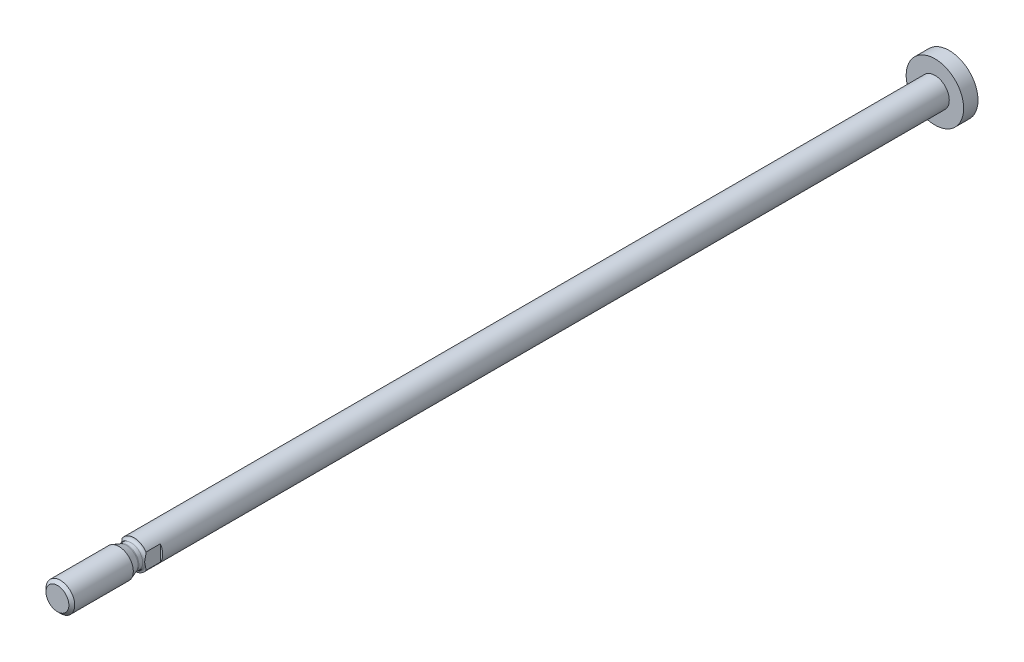
ISO-10303-21;
HEADER;
FILE_DESCRIPTION(('STEP AP214'),'2;1');
FILE_NAME('part.step','',(''),(''),'','','');
FILE_SCHEMA(('AUTOMOTIVE_DESIGN { 1 0 10303 214 1 1 1 1 }'));
ENDSEC;
DATA;
#1=APPLICATION_CONTEXT('core data for automotive mechanical design processes');
#2=APPLICATION_PROTOCOL_DEFINITION('international standard','automotive_design',2000,#1);
#3=PRODUCT_CONTEXT('',#1,'mechanical');
#4=PRODUCT('Part','Part','',(#3));
#5=PRODUCT_RELATED_PRODUCT_CATEGORY('part','',(#4));
#6=PRODUCT_DEFINITION_FORMATION('','',#4);
#7=PRODUCT_DEFINITION_CONTEXT('part definition',#1,'design');
#8=PRODUCT_DEFINITION('design','',#6,#7);
#9=PRODUCT_DEFINITION_SHAPE('','',#8);
#10=(LENGTH_UNIT() NAMED_UNIT(*) SI_UNIT(.MILLI.,.METRE.));
#11=(NAMED_UNIT(*) PLANE_ANGLE_UNIT() SI_UNIT($,.RADIAN.));
#12=(NAMED_UNIT(*) SI_UNIT($,.STERADIAN.) SOLID_ANGLE_UNIT());
#13=UNCERTAINTY_MEASURE_WITH_UNIT(LENGTH_MEASURE(1.E-05),#10,'distance_accuracy_value','');
#14=(GEOMETRIC_REPRESENTATION_CONTEXT(3) GLOBAL_UNCERTAINTY_ASSIGNED_CONTEXT((#13)) GLOBAL_UNIT_ASSIGNED_CONTEXT((#10,
#11,#12)) REPRESENTATION_CONTEXT('',''));
#15=CARTESIAN_POINT('',(0.,0.,0.));
#16=DIRECTION('',(0.,0.,1.));
#17=DIRECTION('',(1.,0.,0.));
#18=AXIS2_PLACEMENT_3D('',#15,#16,#17);
#19=CARTESIAN_POINT('',(0.,0.,-165.3));
#20=DIRECTION('',(0.,0.,1.));
#21=DIRECTION('',(1.,0.,0.));
#22=AXIS2_PLACEMENT_3D('',#19,#20,#21);
#23=CYLINDRICAL_SURFACE('',#22,3.);
#24=CARTESIAN_POINT('',(0.,0.,-162.3));
#25=DIRECTION('',(0.,0.,1.));
#26=DIRECTION('',(1.,0.,0.));
#27=AXIS2_PLACEMENT_3D('',#24,#25,#26);
#28=CIRCLE('',#27,3.);
#29=CARTESIAN_POINT('',(3.,0.,-162.3));
#30=VERTEX_POINT('',#29);
#31=EDGE_CURVE('E121',#30,#30,#28,.T.);
#32=ORIENTED_EDGE('',*,*,#31,.T.);
#33=EDGE_LOOP('',(#32));
#34=FACE_BOUND('',#33,.T.);
#35=DIRECTION('',(0.,0.,1.));
#36=VECTOR('',#35,1.);
#37=CARTESIAN_POINT('',(-2.5,-1.6583123951777,-165.3));
#38=LINE('',#37,#36);
#39=CARTESIAN_POINT('',(-2.5,-1.6583123951777,2.));
#40=VERTEX_POINT('',#39);
#41=CARTESIAN_POINT('',(-2.5,-1.6583123951777,5.));
#42=VERTEX_POINT('',#41);
#43=EDGE_CURVE('E51',#40,#42,#38,.T.);
#44=ORIENTED_EDGE('',*,*,#43,.F.);
#45=CARTESIAN_POINT('',(0.,0.,2.));
#46=DIRECTION('',(0.,0.,1.));
#47=DIRECTION('',(1.,0.,0.));
#48=AXIS2_PLACEMENT_3D('',#45,#46,#47);
#49=CIRCLE('',#48,3.);
#50=CARTESIAN_POINT('',(-2.5,1.6583123951777,2.));
#51=VERTEX_POINT('',#50);
#52=EDGE_CURVE('E11',#51,#40,#49,.T.);
#53=ORIENTED_EDGE('',*,*,#52,.F.);
#54=DIRECTION('',(0.,0.,1.));
#55=VECTOR('',#54,1.);
#56=CARTESIAN_POINT('',(-2.5,1.6583123951777,-165.3));
#57=LINE('',#56,#55);
#58=CARTESIAN_POINT('',(-2.5,1.65831239517778,4.99999999999909));
#59=VERTEX_POINT('',#58);
#60=EDGE_CURVE('E91',#59,#51,#57,.F.);
#61=ORIENTED_EDGE('',*,*,#60,.F.);
#62=CARTESIAN_POINT('',(0.,0.,5.));
#63=DIRECTION('',(0.,0.,1.));
#64=DIRECTION('',(1.,0.,0.));
#65=AXIS2_PLACEMENT_3D('',#62,#63,#64);
#66=CIRCLE('',#65,3.);
#67=CARTESIAN_POINT('',(2.5,1.6583123951777,5.));
#68=VERTEX_POINT('',#67);
#69=EDGE_CURVE('E90',#68,#59,#66,.T.);
#70=ORIENTED_EDGE('',*,*,#69,.F.);
#71=DIRECTION('',(0.,0.,1.));
#72=VECTOR('',#71,1.);
#73=CARTESIAN_POINT('',(2.5,1.6583123951777,-165.3));
#74=LINE('',#73,#72);
#75=CARTESIAN_POINT('',(2.5,1.6583123951777,2.));
#76=VERTEX_POINT('',#75);
#77=EDGE_CURVE('E59',#76,#68,#74,.T.);
#78=ORIENTED_EDGE('',*,*,#77,.F.);
#79=CARTESIAN_POINT('',(2.5,-1.6583123951777,2.));
#80=VERTEX_POINT('',#79);
#81=EDGE_CURVE('E40',#80,#76,#49,.T.);
#82=ORIENTED_EDGE('',*,*,#81,.F.);
#83=DIRECTION('',(0.,0.,1.));
#84=VECTOR('',#83,1.);
#85=CARTESIAN_POINT('',(2.5,-1.6583123951777,-165.3));
#86=LINE('',#85,#84);
#87=CARTESIAN_POINT('',(2.5,-1.65831239517778,4.99999999999909));
#88=VERTEX_POINT('',#87);
#89=EDGE_CURVE('E84',#88,#80,#86,.F.);
#90=ORIENTED_EDGE('',*,*,#89,.F.);
#91=EDGE_CURVE('E124',#42,#88,#66,.T.);
#92=ORIENTED_EDGE('',*,*,#91,.F.);
#93=EDGE_LOOP('',(#44,#53,#61,#70,#78,#82,#90,#92));
#94=FACE_BOUND('',#93,.T.);
#95=ADVANCED_FACE('F37',(#34,#94),#23,.T.);
#96=CARTESIAN_POINT('',(0.,0.,5.6000000000001));
#97=DIRECTION('',(0.,0.,1.));
#98=DIRECTION('',(1.,0.,0.));
#99=AXIS2_PLACEMENT_3D('',#96,#97,#98);
#100=TOROIDAL_SURFACE('',#99,3.0000000000001,0.600000000000099);
#101=CARTESIAN_POINT('',(0.,0.,5.6));
#102=DIRECTION('',(0.,0.,1.));
#103=DIRECTION('',(1.,0.,0.));
#104=AXIS2_PLACEMENT_3D('',#101,#102,#103);
#105=CIRCLE('',#104,2.4);
#106=CARTESIAN_POINT('',(2.4,0.,5.6));
#107=VERTEX_POINT('',#106);
#108=EDGE_CURVE('E112',#107,#107,#105,.T.);
#109=ORIENTED_EDGE('',*,*,#108,.F.);
#110=EDGE_LOOP('',(#109));
#111=FACE_BOUND('',#110,.T.);
#112=CARTESIAN_POINT('',(-2.5,0.,5.26833752096453));
#113=CARTESIAN_POINT('',(-2.5,0.0507234426297441,5.26834839993848));
#114=CARTESIAN_POINT('',(-2.5,0.101441776799662,5.26596843791489));
#115=CARTESIAN_POINT('',(-2.5,0.202536067556288,5.2569952015163));
#116=CARTESIAN_POINT('',(-2.5,0.252911588949165,5.2503973212644));
#117=CARTESIAN_POINT('',(-2.5,0.35392632203634,5.23403658213965));
#118=CARTESIAN_POINT('',(-2.5,0.404557369480025,5.224225913585));
#119=CARTESIAN_POINT('',(-2.5,0.505400398866161,5.20278595137819));
#120=CARTESIAN_POINT('',(-2.5,0.555612509775304,5.1911572409283));
#121=CARTESIAN_POINT('',(-2.5,0.655655613826413,5.16721678219831));
#122=CARTESIAN_POINT('',(-2.5,0.705487327239528,5.15490798008948));
#123=CARTESIAN_POINT('',(-2.5,0.805181864056362,5.13041893752706));
#124=CARTESIAN_POINT('',(-2.5,0.855044688832192,5.11823870324147));
#125=CARTESIAN_POINT('',(-2.5,1.00507376125951,5.08293674920261));
#126=CARTESIAN_POINT('',(-2.5,1.1055660279648,5.06108488117838));
#127=CARTESIAN_POINT('',(-2.5,1.30645493621981,5.02592717471424));
#128=CARTESIAN_POINT('',(-2.5,1.40682678389803,5.01248870030289));
#129=CARTESIAN_POINT('',(-2.5,1.60840199518987,4.99838763017595));
#130=CARTESIAN_POINT('',(-2.5,1.70960094347028,4.99767823287719));
#131=CARTESIAN_POINT('',(-2.5,1.86622781794818,5.01106448653587));
#132=CARTESIAN_POINT('',(-2.5,1.92218137883188,5.01877622049858));
#133=CARTESIAN_POINT('',(-2.5,2.03285053262341,5.0413651074687));
#134=CARTESIAN_POINT('',(-2.5,2.08756307823151,5.05625824117348));
#135=CARTESIAN_POINT('',(-2.5,2.18328084843635,5.09083457513036));
#136=CARTESIAN_POINT('',(-2.5,2.22483950461237,5.10896465354793));
#137=CARTESIAN_POINT('',(-2.5,2.30459524648064,5.1515245306446));
#138=CARTESIAN_POINT('',(-2.5,2.34279989724468,5.17593963670877));
#139=CARTESIAN_POINT('',(-2.5,2.40362753966407,5.22361594487622));
#140=CARTESIAN_POINT('',(-2.5,2.42757076392253,5.24518752529637));
#141=CARTESIAN_POINT('',(-2.5,2.47175757689057,5.29185573262645));
#142=CARTESIAN_POINT('',(-2.5,2.49200531158724,5.31694835263777));
#143=CARTESIAN_POINT('',(-2.5,2.52468492158815,5.36594738678137));
#144=CARTESIAN_POINT('',(-2.5,2.53785643218482,5.38935828111803));
#145=CARTESIAN_POINT('',(-2.5,2.56013164913301,5.43805384411947));
#146=CARTESIAN_POINT('',(-2.5,2.56923737677398,5.46333757440499));
#147=CARTESIAN_POINT('',(-2.5,2.58283057049981,5.51527496834575));
#148=CARTESIAN_POINT('',(-2.5,2.58729356105886,5.54193512227162));
#149=CARTESIAN_POINT('',(-2.5,2.59118020467599,5.59561989324821));
#150=CARTESIAN_POINT('',(-2.5,2.5906054179438,5.62264439487102));
#151=CARTESIAN_POINT('',(-2.5,2.5847447911938,5.67371298536964));
#152=CARTESIAN_POINT('',(-2.5,2.57988467167735,5.69780754958458));
#153=CARTESIAN_POINT('',(-2.5,2.56633022368149,5.74488485425705));
#154=CARTESIAN_POINT('',(-2.5,2.55763543991684,5.76786746233366));
#155=CARTESIAN_POINT('',(-2.5,2.53647695281551,5.81308697753744));
#156=CARTESIAN_POINT('',(-2.5,2.52388217742275,5.83526203314746));
#157=CARTESIAN_POINT('',(-2.5,2.49565831542702,5.87756858678122));
#158=CARTESIAN_POINT('',(-2.5,2.4800283022487,5.897699457906));
#159=CARTESIAN_POINT('',(-2.5,2.4381803160609,5.94494905141413));
#160=CARTESIAN_POINT('',(-2.5,2.41048793322772,5.97076525046522));
#161=CARTESIAN_POINT('',(-2.5,2.35128940318857,6.01762864695372));
#162=CARTESIAN_POINT('',(-2.5,2.31977194494069,6.03866114436212));
#163=CARTESIAN_POINT('',(-2.5,2.23952256294481,6.08463351159361));
#164=CARTESIAN_POINT('',(-2.5,2.18939204577726,6.10711912432076));
#165=CARTESIAN_POINT('',(-2.5,2.086424206848,6.14398267826286));
#166=CARTESIAN_POINT('',(-2.5,2.03358928965091,6.15836768991921));
#167=CARTESIAN_POINT('',(-2.5,1.93599580204544,6.17849484994285));
#168=CARTESIAN_POINT('',(-2.5,1.89144834077192,6.18531116329585));
#169=CARTESIAN_POINT('',(-2.5,1.80189908033616,6.19505697557448));
#170=CARTESIAN_POINT('',(-2.5,1.75689686177072,6.19798247787778));
#171=CARTESIAN_POINT('',(-2.5,1.66646832286127,6.20053377831371));
#172=CARTESIAN_POINT('',(-2.5,1.6210413945456,6.20013412759755));
#173=CARTESIAN_POINT('',(-2.5,1.53034280767568,6.19650595241103));
#174=CARTESIAN_POINT('',(-2.5,1.48507106445849,6.1932793543307));
#175=CARTESIAN_POINT('',(-2.5,1.33918047559004,6.17906735223514));
#176=CARTESIAN_POINT('',(-2.5,1.23902345631669,6.16342028964884));
#177=CARTESIAN_POINT('',(-2.5,1.03994836030368,6.12508984420092));
#178=CARTESIAN_POINT('',(-2.5,0.941034235224376,6.10238806221333));
#179=CARTESIAN_POINT('',(-2.5,0.793509038998567,6.06677672186832));
#180=CARTESIAN_POINT('',(-2.5,0.7446863854637,6.054702575567));
#181=CARTESIAN_POINT('',(-2.5,0.646996290398524,6.030738686552));
#182=CARTESIAN_POINT('',(-2.5,0.598128851070118,6.0188489352388));
#183=CARTESIAN_POINT('',(-2.5,0.500334281886721,5.99617397742217));
#184=CARTESIAN_POINT('',(-2.5,0.451408146263369,5.98538460255591));
#185=CARTESIAN_POINT('',(-2.5,0.353119090508098,5.96594052833405));
#186=CARTESIAN_POINT('',(-2.5,0.303756196305667,5.95728570312374));
#187=CARTESIAN_POINT('',(-2.5,0.204122497966492,5.94328110899502));
#188=CARTESIAN_POINT('',(-2.5,0.153847567097064,5.93795905985694));
#189=CARTESIAN_POINT('',(-2.5,0.0530351286873156,5.93177082830429));
#190=CARTESIAN_POINT('',(-2.5,0.0024977994589948,5.930901937583));
#191=CARTESIAN_POINT('',(-2.5,-0.0985305210715612,5.93381110626722));
#192=CARTESIAN_POINT('',(-2.5,-0.14902123482016,5.93759813511376));
#193=CARTESIAN_POINT('',(-2.5,-0.249573888409545,5.94904126176878));
#194=CARTESIAN_POINT('',(-2.5,-0.299635458091892,5.95670041313862));
#195=CARTESIAN_POINT('',(-2.5,-0.399725252919972,5.97472154484855));
#196=CARTESIAN_POINT('',(-2.5,-0.449748880216866,5.98510788708088));
#197=CARTESIAN_POINT('',(-2.5,-0.549453617514231,6.00732659888942));
#198=CARTESIAN_POINT('',(-2.5,-0.599134785603654,6.01915871651809));
#199=CARTESIAN_POINT('',(-2.5,-0.698392421521691,6.04328051823731));
#200=CARTESIAN_POINT('',(-2.5,-0.747968869022546,6.05557028383309));
#201=CARTESIAN_POINT('',(-2.5,-0.84720464589227,6.07981009984425));
#202=CARTESIAN_POINT('',(-2.5,-0.896863971124109,6.0917601667094));
#203=CARTESIAN_POINT('',(-2.5,-0.975241469303783,6.10978478042876));
#204=CARTESIAN_POINT('',(-2.5,-1.00388150216564,6.11619624816889));
#205=CARTESIAN_POINT('',(-2.5,-1.06125902675178,6.12857195456169));
#206=CARTESIAN_POINT('',(-2.5,-1.08999652018277,6.13453618533974));
#207=CARTESIAN_POINT('',(-2.5,-1.14748265723325,6.1458846074232));
#208=CARTESIAN_POINT('',(-2.5,-1.17623091126653,6.15127075206469));
#209=CARTESIAN_POINT('',(-2.5,-1.23384312688132,6.16137594760793));
#210=CARTESIAN_POINT('',(-2.5,-1.26270708577413,6.16609501391968));
#211=CARTESIAN_POINT('',(-2.5,-1.34949136584038,6.17908804539659));
#212=CARTESIAN_POINT('',(-2.5,-1.40759592627029,6.18619616796949));
#213=CARTESIAN_POINT('',(-2.5,-1.52420669712544,6.19636423685649));
#214=CARTESIAN_POINT('',(-2.5,-1.58271310503325,6.1994220245478));
#215=CARTESIAN_POINT('',(-2.5,-1.70911532678372,6.20051114496721));
#216=CARTESIAN_POINT('',(-2.5,-1.77702602049488,6.19766666103081));
#217=CARTESIAN_POINT('',(-2.5,-1.912149147007,6.18315262249392));
#218=CARTESIAN_POINT('',(-2.5,-1.97936016975703,6.17146782027944));
#219=CARTESIAN_POINT('',(-2.5,-2.09293467910467,6.14162835403314));
#220=CARTESIAN_POINT('',(-2.5,-2.1399801193776,6.12611102431254));
#221=CARTESIAN_POINT('',(-2.5,-2.23116163556241,6.08815370009842));
#222=CARTESIAN_POINT('',(-2.5,-2.27530548479003,6.06573319994486));
#223=CARTESIAN_POINT('',(-2.5,-2.34660579555824,6.0206656653127));
#224=CARTESIAN_POINT('',(-2.5,-2.37498330055351,5.99995880382842));
#225=CARTESIAN_POINT('',(-2.5,-2.42818185419372,5.95435228802646));
#226=CARTESIAN_POINT('',(-2.5,-2.45300628498281,5.92945667074117));
#227=CARTESIAN_POINT('',(-2.5,-2.49337206402375,5.88080957286876));
#228=CARTESIAN_POINT('',(-2.5,-2.50977972671913,5.85778028891266));
#229=CARTESIAN_POINT('',(-2.5,-2.5385948801776,5.80932543735906));
#230=CARTESIAN_POINT('',(-2.5,-2.55100468980703,5.7839012699618));
#231=CARTESIAN_POINT('',(-2.5,-2.57111606880391,5.7310152189761));
#232=CARTESIAN_POINT('',(-2.5,-2.57878240755407,5.70353974708557));
#233=CARTESIAN_POINT('',(-2.5,-2.58865812747843,5.64762323062993));
#234=CARTESIAN_POINT('',(-2.5,-2.59087093912576,5.61918280447873));
#235=CARTESIAN_POINT('',(-2.5,-2.58974032110845,5.56589468768046));
#236=CARTESIAN_POINT('',(-2.5,-2.58704036062141,5.54103102121321));
#237=CARTESIAN_POINT('',(-2.5,-2.57748265423562,5.49212434637714));
#238=CARTESIAN_POINT('',(-2.5,-2.57062518368025,5.46808128377277));
#239=CARTESIAN_POINT('',(-2.5,-2.55318309970271,5.42147694109437));
#240=CARTESIAN_POINT('',(-2.5,-2.54260847384664,5.39891188066154));
#241=CARTESIAN_POINT('',(-2.5,-2.51826231502416,5.35558968714916));
#242=CARTESIAN_POINT('',(-2.5,-2.50448933519591,5.33483337816906));
#243=CARTESIAN_POINT('',(-2.5,-2.46797257111134,5.28708275256527));
#244=CARTESIAN_POINT('',(-2.5,-2.44388663659998,5.26111270404154));
#245=CARTESIAN_POINT('',(-2.5,-2.39183121173732,5.21341702762138));
#246=CARTESIAN_POINT('',(-2.5,-2.36385414462067,5.19169988455002));
#247=CARTESIAN_POINT('',(-2.5,-2.29309604385226,5.14424955817408));
#248=CARTESIAN_POINT('',(-2.5,-2.24896151787955,5.12054273771195));
#249=CARTESIAN_POINT('',(-2.5,-2.15755724893995,5.08032986787273));
#250=CARTESIAN_POINT('',(-2.5,-2.1102815253453,5.0638380357592));
#251=CARTESIAN_POINT('',(-2.5,-1.98539576167196,5.02901994971649));
#252=CARTESIAN_POINT('',(-2.5,-1.90647682078743,5.01544295171964));
#253=CARTESIAN_POINT('',(-2.5,-1.74768813149434,5.00017484346382));
#254=CARTESIAN_POINT('',(-2.5,-1.66781762927049,4.99849388464395));
#255=CARTESIAN_POINT('',(-2.5,-1.45429321635247,5.00579419289827));
#256=CARTESIAN_POINT('',(-2.5,-1.32097329964418,5.02279704607492));
#257=CARTESIAN_POINT('',(-2.5,-1.12273292987174,5.05843900515103));
#258=CARTESIAN_POINT('',(-2.5,-1.05669317759064,5.07208123732001));
#259=CARTESIAN_POINT('',(-2.5,-0.925080173294097,5.10144856377507));
#260=CARTESIAN_POINT('',(-2.5,-0.85950678696237,5.11717303045709));
#261=CARTESIAN_POINT('',(-2.5,-0.728157455724953,5.14928145287764));
#262=CARTESIAN_POINT('',(-2.5,-0.662382356378558,5.16566853749943));
#263=CARTESIAN_POINT('',(-2.5,-0.530451230737349,5.19710748690057));
#264=CARTESIAN_POINT('',(-2.5,-0.46429498692756,5.21215848739435));
#265=CARTESIAN_POINT('',(-2.5,-0.332137198799993,5.23811298682939));
#266=CARTESIAN_POINT('',(-2.5,-0.266147995614798,5.24907485812429));
#267=CARTESIAN_POINT('',(-2.5,-0.13343508853748,5.26417313941374));
#268=CARTESIAN_POINT('',(-2.5,-0.0667131258677896,5.26832321258322));
#269=CARTESIAN_POINT('',(-2.5,0.,5.26833752096453));
#270=B_SPLINE_CURVE_WITH_KNOTS('',3,(#112,#113,#114,#115,#116,#117,#118,#119,#120,#121,#122,
#123,#124,#125,#126,#127,#128,#129,#130,#131,#132,#133,#134,#135,#136,#137,#138,#139,#140,#141,
#142,#143,#144,#145,#146,#147,#148,#149,#150,#151,#152,#153,#154,#155,#156,#157,#158,#159,#160,
#161,#162,#163,#164,#165,#166,#167,#168,#169,#170,#171,#172,#173,#174,#175,#176,#177,#178,#179,
#180,#181,#182,#183,#184,#185,#186,#187,#188,#189,#190,#191,#192,#193,#194,#195,#196,#197,#198,
#199,#200,#201,#202,#203,#204,#205,#206,#207,#208,#209,#210,#211,#212,#213,#214,#215,#216,#217,
#218,#219,#220,#221,#222,#223,#224,#225,#226,#227,#228,#229,#230,#231,#232,#233,#234,#235,#236,
#237,#238,#239,#240,#241,#242,#243,#244,#245,#246,#247,#248,#249,#250,#251,#252,#253,#254,#255,
#256,#257,#258,#259,#260,#261,#262,#263,#264,#265,#266,#267,#268,#269),.UNSPECIFIED.,.T.,.F.,(4,
2,2,2,2,2,2,2,2,2,2,2,2,2,2,2,2,2,2,2,2,2,2,2,2,2,2,2,2,2,2,2,2,2,2,2,2,2,2,2,2,2,2,2,2,2,2,2,2,
2,2,2,2,2,2,2,2,2,2,2,2,2,2,2,2,2,2,2,2,2,2,2,2,2,2,2,2,2,4),(0.,0.152115749462961,
0.304397890479205,0.459057777660119,0.613668153537359,0.76765452052503,0.921648241698668,
1.22999186740174,1.53334327295527,1.83557910296654,2.00468122496769,2.17416139710525,
2.30975526259906,2.44503498191611,2.54138706790922,2.63763038250484,2.71788414225495,
2.79809795959123,2.87873253660465,2.95934214181033,3.03274594433316,3.10615846435156,
3.18237030946167,3.25860545664829,3.37154774885102,3.48483255287211,3.64874326809032,
3.81251069461259,3.94751849926572,4.08266487644991,4.21884653384819,4.35493546397263,
4.65852821936571,4.96291950372185,5.11380283698696,5.2646791123006,5.41496078164642,
5.56523358814694,5.71674021710462,5.86815469233289,6.01986131905259,6.17168776888823,
6.3249195654772,6.47812469716163,6.63135724578266,6.7845823615018,6.87262624262423,
6.9606716735928,7.04840955727845,7.13614541382411,7.31164210225534,7.487232283928,
7.69072100095721,7.89456149389004,8.04275027379228,8.1905243529531,8.29556794817655,
8.40051087855684,8.48500651711341,8.56945305722983,8.65451949621374,8.73953241154295,
8.81419843639983,8.88885951681877,8.96332150589878,9.03781724571823,9.14348655987521,
9.24936459025057,9.39882327642183,9.54857516145059,9.78744806917548,10.0265247936209,
10.4280628477144,10.630387719692,10.8326517473681,11.0360188284461,11.239516519211,
11.439986712254,11.6400543065313),.UNSPECIFIED.);
#271=EDGE_CURVE('E82',#42,#59,#270,.T.);
#272=ORIENTED_EDGE('',*,*,#271,.F.);
#273=ORIENTED_EDGE('',*,*,#91,.T.);
#274=CARTESIAN_POINT('',(2.5,0.,5.26833752096453));
#275=CARTESIAN_POINT('',(2.5,-0.0507234426297441,5.26834839993848));
#276=CARTESIAN_POINT('',(2.5,-0.101441776799662,5.26596843791489));
#277=CARTESIAN_POINT('',(2.5,-0.202536067556288,5.2569952015163));
#278=CARTESIAN_POINT('',(2.5,-0.252911588949165,5.2503973212644));
#279=CARTESIAN_POINT('',(2.5,-0.35392632203634,5.23403658213965));
#280=CARTESIAN_POINT('',(2.5,-0.404557369480025,5.224225913585));
#281=CARTESIAN_POINT('',(2.5,-0.505400398866161,5.20278595137819));
#282=CARTESIAN_POINT('',(2.5,-0.555612509775304,5.1911572409283));
#283=CARTESIAN_POINT('',(2.5,-0.655655613826413,5.16721678219831));
#284=CARTESIAN_POINT('',(2.5,-0.705487327239528,5.15490798008948));
#285=CARTESIAN_POINT('',(2.5,-0.805181864056362,5.13041893752706));
#286=CARTESIAN_POINT('',(2.5,-0.855044688832192,5.11823870324147));
#287=CARTESIAN_POINT('',(2.5,-1.00507376125951,5.08293674920261));
#288=CARTESIAN_POINT('',(2.5,-1.1055660279648,5.06108488117838));
#289=CARTESIAN_POINT('',(2.5,-1.30645493621981,5.02592717471424));
#290=CARTESIAN_POINT('',(2.5,-1.40682678389803,5.01248870030289));
#291=CARTESIAN_POINT('',(2.5,-1.60840199518987,4.99838763017595));
#292=CARTESIAN_POINT('',(2.5,-1.70960094347028,4.99767823287719));
#293=CARTESIAN_POINT('',(2.5,-1.86622781794818,5.01106448653587));
#294=CARTESIAN_POINT('',(2.5,-1.92218137883188,5.01877622049858));
#295=CARTESIAN_POINT('',(2.5,-2.03285053262341,5.0413651074687));
#296=CARTESIAN_POINT('',(2.5,-2.08756307823151,5.05625824117348));
#297=CARTESIAN_POINT('',(2.5,-2.18328084843635,5.09083457513036));
#298=CARTESIAN_POINT('',(2.5,-2.22483950461237,5.10896465354793));
#299=CARTESIAN_POINT('',(2.5,-2.30459524648064,5.1515245306446));
#300=CARTESIAN_POINT('',(2.5,-2.34279989724468,5.17593963670877));
#301=CARTESIAN_POINT('',(2.5,-2.40362753966407,5.22361594487622));
#302=CARTESIAN_POINT('',(2.5,-2.42757076392253,5.24518752529637));
#303=CARTESIAN_POINT('',(2.5,-2.47175757689057,5.29185573262645));
#304=CARTESIAN_POINT('',(2.5,-2.49200531158724,5.31694835263777));
#305=CARTESIAN_POINT('',(2.5,-2.52468492158815,5.36594738678137));
#306=CARTESIAN_POINT('',(2.5,-2.53785643218482,5.38935828111803));
#307=CARTESIAN_POINT('',(2.5,-2.56013164913301,5.43805384411947));
#308=CARTESIAN_POINT('',(2.5,-2.56923737677398,5.46333757440499));
#309=CARTESIAN_POINT('',(2.5,-2.58283057049981,5.51527496834575));
#310=CARTESIAN_POINT('',(2.5,-2.58729356105886,5.54193512227162));
#311=CARTESIAN_POINT('',(2.5,-2.59118020467599,5.59561989324821));
#312=CARTESIAN_POINT('',(2.5,-2.5906054179438,5.62264439487102));
#313=CARTESIAN_POINT('',(2.5,-2.5847447911938,5.67371298536964));
#314=CARTESIAN_POINT('',(2.5,-2.57988467167735,5.69780754958458));
#315=CARTESIAN_POINT('',(2.5,-2.56633022368149,5.74488485425705));
#316=CARTESIAN_POINT('',(2.5,-2.55763543991684,5.76786746233366));
#317=CARTESIAN_POINT('',(2.5,-2.53647695281551,5.81308697753744));
#318=CARTESIAN_POINT('',(2.5,-2.52388217742275,5.83526203314746));
#319=CARTESIAN_POINT('',(2.5,-2.49565831542702,5.87756858678122));
#320=CARTESIAN_POINT('',(2.5,-2.4800283022487,5.897699457906));
#321=CARTESIAN_POINT('',(2.5,-2.4381803160609,5.94494905141413));
#322=CARTESIAN_POINT('',(2.5,-2.41048793322772,5.97076525046522));
#323=CARTESIAN_POINT('',(2.5,-2.35128940318857,6.01762864695372));
#324=CARTESIAN_POINT('',(2.5,-2.31977194494069,6.03866114436212));
#325=CARTESIAN_POINT('',(2.5,-2.23952256294481,6.08463351159361));
#326=CARTESIAN_POINT('',(2.5,-2.18939204577726,6.10711912432076));
#327=CARTESIAN_POINT('',(2.5,-2.086424206848,6.14398267826286));
#328=CARTESIAN_POINT('',(2.5,-2.03358928965091,6.15836768991921));
#329=CARTESIAN_POINT('',(2.5,-1.93599580204544,6.17849484994285));
#330=CARTESIAN_POINT('',(2.5,-1.89144834077192,6.18531116329585));
#331=CARTESIAN_POINT('',(2.5,-1.80189908033616,6.19505697557448));
#332=CARTESIAN_POINT('',(2.5,-1.75689686177072,6.19798247787778));
#333=CARTESIAN_POINT('',(2.5,-1.66646832286127,6.20053377831371));
#334=CARTESIAN_POINT('',(2.5,-1.6210413945456,6.20013412759755));
#335=CARTESIAN_POINT('',(2.5,-1.53034280767568,6.19650595241103));
#336=CARTESIAN_POINT('',(2.5,-1.48507106445849,6.1932793543307));
#337=CARTESIAN_POINT('',(2.5,-1.33918047559004,6.17906735223514));
#338=CARTESIAN_POINT('',(2.5,-1.23902345631669,6.16342028964884));
#339=CARTESIAN_POINT('',(2.5,-1.03994836030368,6.12508984420092));
#340=CARTESIAN_POINT('',(2.5,-0.941034235224376,6.10238806221333));
#341=CARTESIAN_POINT('',(2.5,-0.793509038998567,6.06677672186832));
#342=CARTESIAN_POINT('',(2.5,-0.7446863854637,6.054702575567));
#343=CARTESIAN_POINT('',(2.5,-0.646996290398524,6.030738686552));
#344=CARTESIAN_POINT('',(2.5,-0.598128851070118,6.0188489352388));
#345=CARTESIAN_POINT('',(2.5,-0.500334281886721,5.99617397742217));
#346=CARTESIAN_POINT('',(2.5,-0.451408146263369,5.98538460255591));
#347=CARTESIAN_POINT('',(2.5,-0.353119090508098,5.96594052833405));
#348=CARTESIAN_POINT('',(2.5,-0.303756196305667,5.95728570312374));
#349=CARTESIAN_POINT('',(2.5,-0.204122497966492,5.94328110899502));
#350=CARTESIAN_POINT('',(2.5,-0.153847567097064,5.93795905985694));
#351=CARTESIAN_POINT('',(2.5,-0.0530351286873156,5.93177082830429));
#352=CARTESIAN_POINT('',(2.5,-0.0024977994589948,5.930901937583));
#353=CARTESIAN_POINT('',(2.5,0.0985305210715612,5.93381110626722));
#354=CARTESIAN_POINT('',(2.5,0.14902123482016,5.93759813511376));
#355=CARTESIAN_POINT('',(2.5,0.249573888409545,5.94904126176878));
#356=CARTESIAN_POINT('',(2.5,0.299635458091892,5.95670041313862));
#357=CARTESIAN_POINT('',(2.5,0.399725252919972,5.97472154484855));
#358=CARTESIAN_POINT('',(2.5,0.449748880216866,5.98510788708088));
#359=CARTESIAN_POINT('',(2.5,0.549453617514231,6.00732659888942));
#360=CARTESIAN_POINT('',(2.5,0.599134785603654,6.01915871651809));
#361=CARTESIAN_POINT('',(2.5,0.698392421521691,6.04328051823731));
#362=CARTESIAN_POINT('',(2.5,0.747968869022546,6.05557028383309));
#363=CARTESIAN_POINT('',(2.5,0.84720464589227,6.07981009984425));
#364=CARTESIAN_POINT('',(2.5,0.896863971124109,6.0917601667094));
#365=CARTESIAN_POINT('',(2.5,0.975241469303783,6.10978478042876));
#366=CARTESIAN_POINT('',(2.5,1.00388150216564,6.11619624816889));
#367=CARTESIAN_POINT('',(2.5,1.06125902675178,6.12857195456169));
#368=CARTESIAN_POINT('',(2.5,1.08999652018277,6.13453618533974));
#369=CARTESIAN_POINT('',(2.5,1.14748265723325,6.1458846074232));
#370=CARTESIAN_POINT('',(2.5,1.17623091126653,6.15127075206469));
#371=CARTESIAN_POINT('',(2.5,1.23384312688132,6.16137594760793));
#372=CARTESIAN_POINT('',(2.5,1.26270708577413,6.16609501391968));
#373=CARTESIAN_POINT('',(2.5,1.34949136584038,6.17908804539659));
#374=CARTESIAN_POINT('',(2.5,1.40759592627029,6.18619616796949));
#375=CARTESIAN_POINT('',(2.5,1.52420669712544,6.19636423685649));
#376=CARTESIAN_POINT('',(2.5,1.58271310503325,6.1994220245478));
#377=CARTESIAN_POINT('',(2.5,1.70911532678372,6.20051114496721));
#378=CARTESIAN_POINT('',(2.5,1.77702602049488,6.19766666103081));
#379=CARTESIAN_POINT('',(2.5,1.912149147007,6.18315262249392));
#380=CARTESIAN_POINT('',(2.5,1.97936016975703,6.17146782027944));
#381=CARTESIAN_POINT('',(2.5,2.09293467910467,6.14162835403314));
#382=CARTESIAN_POINT('',(2.5,2.1399801193776,6.12611102431254));
#383=CARTESIAN_POINT('',(2.5,2.23116163556241,6.08815370009842));
#384=CARTESIAN_POINT('',(2.5,2.27530548479003,6.06573319994486));
#385=CARTESIAN_POINT('',(2.5,2.34660579555824,6.0206656653127));
#386=CARTESIAN_POINT('',(2.5,2.37498330055351,5.99995880382842));
#387=CARTESIAN_POINT('',(2.5,2.42818185419372,5.95435228802646));
#388=CARTESIAN_POINT('',(2.5,2.45300628498281,5.92945667074117));
#389=CARTESIAN_POINT('',(2.5,2.49337206402375,5.88080957286876));
#390=CARTESIAN_POINT('',(2.5,2.50977972671913,5.85778028891266));
#391=CARTESIAN_POINT('',(2.5,2.5385948801776,5.80932543735906));
#392=CARTESIAN_POINT('',(2.5,2.55100468980703,5.7839012699618));
#393=CARTESIAN_POINT('',(2.5,2.57111606880391,5.7310152189761));
#394=CARTESIAN_POINT('',(2.5,2.57878240755407,5.70353974708557));
#395=CARTESIAN_POINT('',(2.5,2.58865812747843,5.64762323062993));
#396=CARTESIAN_POINT('',(2.5,2.59087093912576,5.61918280447873));
#397=CARTESIAN_POINT('',(2.5,2.58974032110845,5.56589468768046));
#398=CARTESIAN_POINT('',(2.5,2.58704036062141,5.54103102121321));
#399=CARTESIAN_POINT('',(2.5,2.57748265423562,5.49212434637714));
#400=CARTESIAN_POINT('',(2.5,2.57062518368025,5.46808128377277));
#401=CARTESIAN_POINT('',(2.5,2.55318309970271,5.42147694109437));
#402=CARTESIAN_POINT('',(2.5,2.54260847384664,5.39891188066154));
#403=CARTESIAN_POINT('',(2.5,2.51826231502416,5.35558968714916));
#404=CARTESIAN_POINT('',(2.5,2.50448933519591,5.33483337816906));
#405=CARTESIAN_POINT('',(2.5,2.46797257111134,5.28708275256527));
#406=CARTESIAN_POINT('',(2.5,2.44388663659998,5.26111270404154));
#407=CARTESIAN_POINT('',(2.5,2.39183121173732,5.21341702762138));
#408=CARTESIAN_POINT('',(2.5,2.36385414462067,5.19169988455002));
#409=CARTESIAN_POINT('',(2.5,2.29309604385226,5.14424955817408));
#410=CARTESIAN_POINT('',(2.5,2.24896151787955,5.12054273771195));
#411=CARTESIAN_POINT('',(2.5,2.15755724893995,5.08032986787273));
#412=CARTESIAN_POINT('',(2.5,2.1102815253453,5.0638380357592));
#413=CARTESIAN_POINT('',(2.5,1.98539576167196,5.02901994971649));
#414=CARTESIAN_POINT('',(2.5,1.90647682078743,5.01544295171964));
#415=CARTESIAN_POINT('',(2.5,1.74768813149434,5.00017484346382));
#416=CARTESIAN_POINT('',(2.5,1.66781762927049,4.99849388464395));
#417=CARTESIAN_POINT('',(2.5,1.45429321635247,5.00579419289827));
#418=CARTESIAN_POINT('',(2.5,1.32097329964418,5.02279704607492));
#419=CARTESIAN_POINT('',(2.5,1.12273292987174,5.05843900515103));
#420=CARTESIAN_POINT('',(2.5,1.05669317759064,5.07208123732001));
#421=CARTESIAN_POINT('',(2.5,0.925080173294097,5.10144856377507));
#422=CARTESIAN_POINT('',(2.5,0.85950678696237,5.11717303045709));
#423=CARTESIAN_POINT('',(2.5,0.728157455724953,5.14928145287764));
#424=CARTESIAN_POINT('',(2.5,0.662382356378558,5.16566853749943));
#425=CARTESIAN_POINT('',(2.5,0.530451230737349,5.19710748690057));
#426=CARTESIAN_POINT('',(2.5,0.46429498692756,5.21215848739435));
#427=CARTESIAN_POINT('',(2.5,0.332137198799993,5.23811298682939));
#428=CARTESIAN_POINT('',(2.5,0.266147995614798,5.24907485812429));
#429=CARTESIAN_POINT('',(2.5,0.13343508853748,5.26417313941374));
#430=CARTESIAN_POINT('',(2.5,0.0667131258677896,5.26832321258322));
#431=CARTESIAN_POINT('',(2.5,0.,5.26833752096453));
#432=B_SPLINE_CURVE_WITH_KNOTS('',3,(#274,#275,#276,#277,#278,#279,#280,#281,#282,#283,#284,
#285,#286,#287,#288,#289,#290,#291,#292,#293,#294,#295,#296,#297,#298,#299,#300,#301,#302,#303,
#304,#305,#306,#307,#308,#309,#310,#311,#312,#313,#314,#315,#316,#317,#318,#319,#320,#321,#322,
#323,#324,#325,#326,#327,#328,#329,#330,#331,#332,#333,#334,#335,#336,#337,#338,#339,#340,#341,
#342,#343,#344,#345,#346,#347,#348,#349,#350,#351,#352,#353,#354,#355,#356,#357,#358,#359,#360,
#361,#362,#363,#364,#365,#366,#367,#368,#369,#370,#371,#372,#373,#374,#375,#376,#377,#378,#379,
#380,#381,#382,#383,#384,#385,#386,#387,#388,#389,#390,#391,#392,#393,#394,#395,#396,#397,#398,
#399,#400,#401,#402,#403,#404,#405,#406,#407,#408,#409,#410,#411,#412,#413,#414,#415,#416,#417,
#418,#419,#420,#421,#422,#423,#424,#425,#426,#427,#428,#429,#430,#431),.UNSPECIFIED.,.T.,.F.,(4,
2,2,2,2,2,2,2,2,2,2,2,2,2,2,2,2,2,2,2,2,2,2,2,2,2,2,2,2,2,2,2,2,2,2,2,2,2,2,2,2,2,2,2,2,2,2,2,2,
2,2,2,2,2,2,2,2,2,2,2,2,2,2,2,2,2,2,2,2,2,2,2,2,2,2,2,2,2,4),(0.,0.152115749462961,
0.304397890479205,0.459057777660119,0.613668153537359,0.76765452052503,0.921648241698668,
1.22999186740174,1.53334327295527,1.83557910296654,2.00468122496769,2.17416139710525,
2.30975526259906,2.44503498191611,2.54138706790922,2.63763038250484,2.71788414225495,
2.79809795959123,2.87873253660465,2.95934214181033,3.03274594433316,3.10615846435156,
3.18237030946167,3.25860545664829,3.37154774885102,3.48483255287211,3.64874326809032,
3.81251069461259,3.94751849926572,4.08266487644991,4.21884653384819,4.35493546397263,
4.65852821936571,4.96291950372185,5.11380283698696,5.2646791123006,5.41496078164642,
5.56523358814694,5.71674021710462,5.86815469233289,6.01986131905259,6.17168776888823,
6.3249195654772,6.47812469716163,6.63135724578266,6.7845823615018,6.87262624262423,
6.9606716735928,7.04840955727845,7.13614541382411,7.31164210225534,7.487232283928,
7.69072100095721,7.89456149389004,8.04275027379228,8.1905243529531,8.29556794817655,
8.40051087855684,8.48500651711341,8.56945305722983,8.65451949621374,8.73953241154295,
8.81419843639983,8.88885951681877,8.96332150589878,9.03781724571823,9.14348655987521,
9.24936459025057,9.39882327642183,9.54857516145059,9.78744806917548,10.0265247936209,
10.4280628477144,10.630387719692,10.8326517473681,11.0360188284461,11.239516519211,
11.439986712254,11.6400543065313),.UNSPECIFIED.);
#433=EDGE_CURVE('E126',#68,#88,#432,.T.);
#434=ORIENTED_EDGE('',*,*,#433,.F.);
#435=ORIENTED_EDGE('',*,*,#69,.T.);
#436=EDGE_LOOP('',(#272,#273,#434,#435));
#437=FACE_BOUND('',#436,.T.);
#438=ADVANCED_FACE('F134',(#111,#437),#100,.F.);
#439=CARTESIAN_POINT('',(0.,3.,-162.3));
#440=DIRECTION('',(0.,0.,-1.));
#441=DIRECTION('',(-1.,0.,0.));
#442=AXIS2_PLACEMENT_3D('',#439,#440,#441);
#443=PLANE('',#442);
#444=ORIENTED_EDGE('',*,*,#31,.F.);
#445=EDGE_LOOP('',(#444));
#446=FACE_BOUND('',#445,.T.);
#447=CARTESIAN_POINT('',(0.,0.,-162.3));
#448=DIRECTION('',(0.,0.,1.));
#449=DIRECTION('',(1.,0.,0.));
#450=AXIS2_PLACEMENT_3D('',#447,#448,#449);
#451=CIRCLE('',#450,6.);
#452=CARTESIAN_POINT('',(6.,0.,-162.3));
#453=VERTEX_POINT('',#452);
#454=EDGE_CURVE('E118',#453,#453,#451,.T.);
#455=ORIENTED_EDGE('',*,*,#454,.T.);
#456=EDGE_LOOP('',(#455));
#457=FACE_BOUND('',#456,.T.);
#458=ADVANCED_FACE('F181',(#446,#457),#443,.F.);
#459=CARTESIAN_POINT('',(0.,0.,-165.3));
#460=DIRECTION('',(0.,0.,1.));
#461=DIRECTION('',(1.,0.,0.));
#462=AXIS2_PLACEMENT_3D('',#459,#460,#461);
#463=CYLINDRICAL_SURFACE('',#462,6.);
#464=ORIENTED_EDGE('',*,*,#454,.F.);
#465=EDGE_LOOP('',(#464));
#466=FACE_BOUND('',#465,.T.);
#467=CARTESIAN_POINT('',(0.,0.,-165.3));
#468=DIRECTION('',(0.,0.,1.));
#469=DIRECTION('',(1.,0.,0.));
#470=AXIS2_PLACEMENT_3D('',#467,#468,#469);
#471=CIRCLE('',#470,6.);
#472=CARTESIAN_POINT('',(6.,0.,-165.3));
#473=VERTEX_POINT('',#472);
#474=EDGE_CURVE('E115',#473,#473,#471,.T.);
#475=ORIENTED_EDGE('',*,*,#474,.T.);
#476=EDGE_LOOP('',(#475));
#477=FACE_BOUND('',#476,.T.);
#478=ADVANCED_FACE('F172',(#466,#477),#463,.T.);
#479=CARTESIAN_POINT('',(0.,6.,-165.3));
#480=DIRECTION('',(0.,0.,1.));
#481=DIRECTION('',(1.,0.,0.));
#482=AXIS2_PLACEMENT_3D('',#479,#480,#481);
#483=PLANE('',#482);
#484=ORIENTED_EDGE('',*,*,#474,.F.);
#485=EDGE_LOOP('',(#484));
#486=FACE_BOUND('',#485,.T.);
#487=ADVANCED_FACE('F167',(#486),#483,.F.);
#488=CARTESIAN_POINT('',(0.,0.,4.));
#489=DIRECTION('',(0.,0.,1.));
#490=DIRECTION('',(1.,0.,0.));
#491=AXIS2_PLACEMENT_3D('',#488,#489,#490);
#492=CYLINDRICAL_SURFACE('',#491,2.4);
#493=CARTESIAN_POINT('',(0.,0.,6.3942038115749));
#494=DIRECTION('',(0.,0.,1.));
#495=DIRECTION('',(1.,0.,0.));
#496=AXIS2_PLACEMENT_3D('',#493,#494,#495);
#497=CIRCLE('',#496,2.4);
#498=CARTESIAN_POINT('',(2.4,0.,6.3942038115749));
#499=VERTEX_POINT('',#498);
#500=EDGE_CURVE('E109',#499,#499,#497,.T.);
#501=ORIENTED_EDGE('',*,*,#500,.F.);
#502=EDGE_LOOP('',(#501));
#503=FACE_BOUND('',#502,.T.);
#504=ORIENTED_EDGE('',*,*,#108,.T.);
#505=EDGE_LOOP('',(#504));
#506=FACE_BOUND('',#505,.T.);
#507=ADVANCED_FACE('F164',(#503,#506),#492,.T.);
#508=CARTESIAN_POINT('',(0.,0.,6.39420381157482));
#509=DIRECTION('',(0.,0.,1.));
#510=DIRECTION('',(1.,0.,0.));
#511=AXIS2_PLACEMENT_3D('',#508,#509,#510);
#512=TOROIDAL_SURFACE('',#511,2.99999999999972,0.599999999999719);
#513=CARTESIAN_POINT('',(0.,0.,6.5994158975703));
#514=DIRECTION('',(0.,0.,1.));
#515=DIRECTION('',(1.,0.,0.));
#516=AXIS2_PLACEMENT_3D('',#513,#514,#515);
#517=CIRCLE('',#516,2.4361844275285);
#518=CARTESIAN_POINT('',(2.4361844275285,0.,6.5994158975703));
#519=VERTEX_POINT('',#518);
#520=EDGE_CURVE('E106',#519,#519,#517,.T.);
#521=ORIENTED_EDGE('',*,*,#520,.F.);
#522=EDGE_LOOP('',(#521));
#523=FACE_BOUND('',#522,.T.);
#524=ORIENTED_EDGE('',*,*,#500,.T.);
#525=EDGE_LOOP('',(#524));
#526=FACE_BOUND('',#525,.T.);
#527=ADVANCED_FACE('F161',(#523,#526),#512,.F.);
#528=CARTESIAN_POINT('',(0.,0.,6.5994158975703));
#529=DIRECTION('',(0.,0.,1.));
#530=DIRECTION('',(1.,0.,0.));
#531=AXIS2_PLACEMENT_3D('',#528,#529,#530);
#532=CONICAL_SURFACE('',#531,2.4361844275285,0.34906585039883);
#533=CARTESIAN_POINT('',(0.,0.,8.1484864516728));
#534=DIRECTION('',(0.,0.,1.));
#535=DIRECTION('',(1.,0.,0.));
#536=AXIS2_PLACEMENT_3D('',#533,#534,#535);
#537=CIRCLE('',#536,3.);
#538=CARTESIAN_POINT('',(3.,0.,8.1484864516728));
#539=VERTEX_POINT('',#538);
#540=EDGE_CURVE('E103',#539,#539,#537,.T.);
#541=ORIENTED_EDGE('',*,*,#540,.F.);
#542=EDGE_LOOP('',(#541));
#543=FACE_BOUND('',#542,.T.);
#544=ORIENTED_EDGE('',*,*,#520,.T.);
#545=EDGE_LOOP('',(#544));
#546=FACE_BOUND('',#545,.T.);
#547=ADVANCED_FACE('F157',(#543,#546),#532,.T.);
#548=CARTESIAN_POINT('',(0.,0.,4.));
#549=DIRECTION('',(0.,0.,1.));
#550=DIRECTION('',(1.,0.,0.));
#551=AXIS2_PLACEMENT_3D('',#548,#549,#550);
#552=CYLINDRICAL_SURFACE('',#551,3.);
#553=CARTESIAN_POINT('',(0.,0.,20.3865));
#554=DIRECTION('',(0.,0.,1.));
#555=DIRECTION('',(1.,0.,0.));
#556=AXIS2_PLACEMENT_3D('',#553,#554,#555);
#557=CIRCLE('',#556,3.);
#558=CARTESIAN_POINT('',(3.,0.,20.3865));
#559=VERTEX_POINT('',#558);
#560=EDGE_CURVE('E100',#559,#559,#557,.T.);
#561=ORIENTED_EDGE('',*,*,#560,.F.);
#562=EDGE_LOOP('',(#561));
#563=FACE_BOUND('',#562,.T.);
#564=ORIENTED_EDGE('',*,*,#540,.T.);
#565=EDGE_LOOP('',(#564));
#566=FACE_BOUND('',#565,.T.);
#567=ADVANCED_FACE('F153',(#563,#566),#552,.T.);
#568=CARTESIAN_POINT('',(0.,0.,20.3865));
#569=DIRECTION('',(0.,0.,-1.));
#570=DIRECTION('',(-1.,0.,0.));
#571=AXIS2_PLACEMENT_3D('',#568,#569,#570);
#572=CONICAL_SURFACE('',#571,3.,0.785398163397449);
#573=CARTESIAN_POINT('',(0.,0.,21.));
#574=DIRECTION('',(0.,0.,1.));
#575=DIRECTION('',(1.,0.,0.));
#576=AXIS2_PLACEMENT_3D('',#573,#574,#575);
#577=CIRCLE('',#576,2.3865);
#578=CARTESIAN_POINT('',(2.3865,0.,21.));
#579=VERTEX_POINT('',#578);
#580=EDGE_CURVE('E97',#579,#579,#577,.T.);
#581=ORIENTED_EDGE('',*,*,#580,.F.);
#582=EDGE_LOOP('',(#581));
#583=FACE_BOUND('',#582,.T.);
#584=ORIENTED_EDGE('',*,*,#560,.T.);
#585=EDGE_LOOP('',(#584));
#586=FACE_BOUND('',#585,.T.);
#587=ADVANCED_FACE('F149',(#583,#586),#572,.T.);
#588=CARTESIAN_POINT('',(0.,0.,21.));
#589=DIRECTION('',(0.,0.,-1.));
#590=DIRECTION('',(-1.,0.,0.));
#591=AXIS2_PLACEMENT_3D('',#588,#589,#590);
#592=PLANE('',#591);
#593=ORIENTED_EDGE('',*,*,#580,.T.);
#594=EDGE_LOOP('',(#593));
#595=FACE_BOUND('',#594,.T.);
#596=ADVANCED_FACE('F141',(#595),#592,.F.);
#597=CARTESIAN_POINT('',(2.5,5.,6.));
#598=DIRECTION('',(1.,0.,0.));
#599=DIRECTION('',(0.,0.,-1.));
#600=AXIS2_PLACEMENT_3D('',#597,#598,#599);
#601=PLANE('',#600);
#602=ORIENTED_EDGE('',*,*,#77,.T.);
#603=ORIENTED_EDGE('',*,*,#433,.T.);
#604=ORIENTED_EDGE('',*,*,#89,.T.);
#605=DIRECTION('',(0.,-1.,0.));
#606=VECTOR('',#605,1.);
#607=CARTESIAN_POINT('',(2.5,5.,2.));
#608=LINE('',#607,#606);
#609=EDGE_CURVE('E79',#76,#80,#608,.T.);
#610=ORIENTED_EDGE('',*,*,#609,.F.);
#611=EDGE_LOOP('',(#602,#603,#604,#610));
#612=FACE_BOUND('',#611,.T.);
#613=ADVANCED_FACE('F83',(#612),#601,.T.);
#614=CARTESIAN_POINT('',(0.,0.,2.));
#615=DIRECTION('',(0.,0.,1.));
#616=DIRECTION('',(1.,0.,0.));
#617=AXIS2_PLACEMENT_3D('',#614,#615,#616);
#618=PLANE('',#617);
#619=ORIENTED_EDGE('',*,*,#81,.T.);
#620=ORIENTED_EDGE('',*,*,#609,.T.);
#621=EDGE_LOOP('',(#619,#620));
#622=FACE_BOUND('',#621,.T.);
#623=ADVANCED_FACE('F78',(#622),#618,.T.);
#624=ORIENTED_EDGE('',*,*,#52,.T.);
#625=DIRECTION('',(0.,1.,0.));
#626=VECTOR('',#625,1.);
#627=CARTESIAN_POINT('',(-2.5,-5.,2.));
#628=LINE('',#627,#626);
#629=EDGE_CURVE('E85',#40,#51,#628,.T.);
#630=ORIENTED_EDGE('',*,*,#629,.T.);
#631=EDGE_LOOP('',(#624,#630));
#632=FACE_BOUND('',#631,.T.);
#633=ADVANCED_FACE('F142',(#632),#618,.T.);
#634=CARTESIAN_POINT('',(-2.5,-5.,6.));
#635=DIRECTION('',(-1.,0.,0.));
#636=DIRECTION('',(0.,0.,1.));
#637=AXIS2_PLACEMENT_3D('',#634,#635,#636);
#638=PLANE('',#637);
#639=ORIENTED_EDGE('',*,*,#43,.T.);
#640=ORIENTED_EDGE('',*,*,#271,.T.);
#641=ORIENTED_EDGE('',*,*,#60,.T.);
#642=ORIENTED_EDGE('',*,*,#629,.F.);
#643=EDGE_LOOP('',(#639,#640,#641,#642));
#644=FACE_BOUND('',#643,.T.);
#645=ADVANCED_FACE('F143',(#644),#638,.T.);
#646=CLOSED_SHELL('',(#95,#438,#458,#478,#487,#507,#527,#547,#567,#587,#596,#613,#623,#633,#645));
#647=MANIFOLD_SOLID_BREP('B2',#646);
#648=ADVANCED_BREP_SHAPE_REPRESENTATION('',(#18,#647),#14);
#649=SHAPE_DEFINITION_REPRESENTATION(#9,#648);
ENDSEC;
END-ISO-10303-21;
